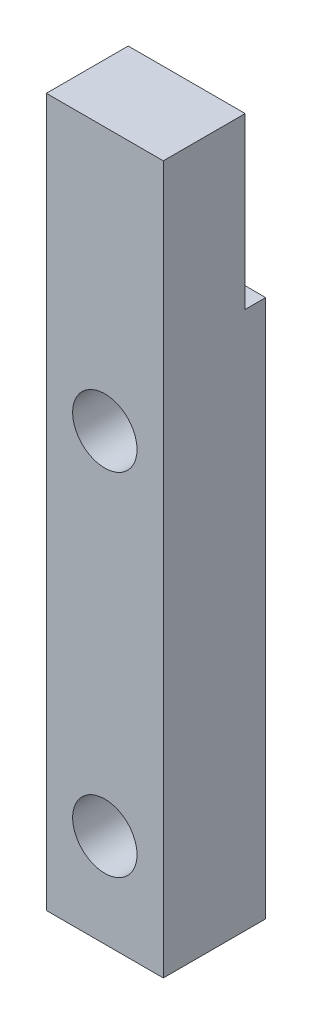
ISO-10303-21;
HEADER;
FILE_DESCRIPTION(('STEP AP214'),'2;1');
FILE_NAME('part.step','',(''),(''),'','','');
FILE_SCHEMA(('AUTOMOTIVE_DESIGN { 1 0 10303 214 1 1 1 1 }'));
ENDSEC;
DATA;
#1=APPLICATION_CONTEXT('core data for automotive mechanical design processes');
#2=APPLICATION_PROTOCOL_DEFINITION('international standard','automotive_design',2000,#1);
#3=PRODUCT_CONTEXT('',#1,'mechanical');
#4=PRODUCT('Part','Part','',(#3));
#5=PRODUCT_RELATED_PRODUCT_CATEGORY('part','',(#4));
#6=PRODUCT_DEFINITION_FORMATION('','',#4);
#7=PRODUCT_DEFINITION_CONTEXT('part definition',#1,'design');
#8=PRODUCT_DEFINITION('design','',#6,#7);
#9=PRODUCT_DEFINITION_SHAPE('','',#8);
#10=(LENGTH_UNIT() NAMED_UNIT(*) SI_UNIT(.MILLI.,.METRE.));
#11=(NAMED_UNIT(*) PLANE_ANGLE_UNIT() SI_UNIT($,.RADIAN.));
#12=(NAMED_UNIT(*) SI_UNIT($,.STERADIAN.) SOLID_ANGLE_UNIT());
#13=UNCERTAINTY_MEASURE_WITH_UNIT(LENGTH_MEASURE(1.E-05),#10,'distance_accuracy_value','');
#14=(GEOMETRIC_REPRESENTATION_CONTEXT(3) GLOBAL_UNCERTAINTY_ASSIGNED_CONTEXT((#13)) GLOBAL_UNIT_ASSIGNED_CONTEXT((#10,
#11,#12)) REPRESENTATION_CONTEXT('',''));
#15=CARTESIAN_POINT('',(0.,0.,0.));
#16=DIRECTION('',(0.,0.,1.));
#17=DIRECTION('',(1.,0.,0.));
#18=AXIS2_PLACEMENT_3D('',#15,#16,#17);
#19=CARTESIAN_POINT('',(0.,0.,300.));
#20=DIRECTION('',(0.,0.,-1.));
#21=DIRECTION('',(-1.,0.,0.));
#22=AXIS2_PLACEMENT_3D('',#19,#20,#21);
#23=PLANE('',#22);
#24=CARTESIAN_POINT('',(85.,-9.99999999999999,300.));
#25=DIRECTION('',(0.,0.,1.));
#26=DIRECTION('',(1.,0.,0.));
#27=AXIS2_PLACEMENT_3D('',#24,#25,#26);
#28=CIRCLE('',#27,5.5);
#29=CARTESIAN_POINT('',(90.5,-9.99999999999999,300.));
#30=VERTEX_POINT('',#29);
#31=EDGE_CURVE('E96',#30,#30,#28,.T.);
#32=ORIENTED_EDGE('',*,*,#31,.T.);
#33=EDGE_LOOP('',(#32));
#34=FACE_BOUND('',#33,.T.);
#35=DIRECTION('',(1.,0.,0.));
#36=VECTOR('',#35,1.);
#37=CARTESIAN_POINT('',(85.,-26.,300.));
#38=LINE('',#37,#36);
#39=CARTESIAN_POINT('',(75.,-26.,300.));
#40=VERTEX_POINT('',#39);
#41=CARTESIAN_POINT('',(95.,-26.,300.));
#42=VERTEX_POINT('',#41);
#43=EDGE_CURVE('E72',#40,#42,#38,.T.);
#44=ORIENTED_EDGE('',*,*,#43,.F.);
#45=DIRECTION('',(0.,-1.,0.));
#46=VECTOR('',#45,1.);
#47=CARTESIAN_POINT('',(75.,60.,300.));
#48=LINE('',#47,#46);
#49=CARTESIAN_POINT('',(75.,66.,300.));
#50=VERTEX_POINT('',#49);
#51=EDGE_CURVE('E85',#50,#40,#48,.T.);
#52=ORIENTED_EDGE('',*,*,#51,.F.);
#53=DIRECTION('',(-1.,0.,0.));
#54=VECTOR('',#53,1.);
#55=CARTESIAN_POINT('',(75.,66.,300.));
#56=LINE('',#55,#54);
#57=CARTESIAN_POINT('',(95.,66.,300.));
#58=VERTEX_POINT('',#57);
#59=EDGE_CURVE('E71',#58,#50,#56,.T.);
#60=ORIENTED_EDGE('',*,*,#59,.F.);
#61=DIRECTION('',(0.,1.,0.));
#62=VECTOR('',#61,1.);
#63=CARTESIAN_POINT('',(95.,-26.,300.));
#64=LINE('',#63,#62);
#65=EDGE_CURVE('E64',#42,#58,#64,.T.);
#66=ORIENTED_EDGE('',*,*,#65,.F.);
#67=EDGE_LOOP('',(#44,#52,#60,#66));
#68=FACE_BOUND('',#67,.T.);
#69=CARTESIAN_POINT('',(85.,50.,300.));
#70=DIRECTION('',(0.,0.,1.));
#71=DIRECTION('',(1.,0.,0.));
#72=AXIS2_PLACEMENT_3D('',#69,#70,#71);
#73=CIRCLE('',#72,5.5);
#74=CARTESIAN_POINT('',(90.5,50.,300.));
#75=VERTEX_POINT('',#74);
#76=EDGE_CURVE('E100',#75,#75,#73,.T.);
#77=ORIENTED_EDGE('',*,*,#76,.T.);
#78=EDGE_LOOP('',(#77));
#79=FACE_BOUND('',#78,.T.);
#80=ADVANCED_FACE('F33',(#34,#68,#79),#23,.T.);
#81=CARTESIAN_POINT('',(85.,-26.,303.5));
#82=DIRECTION('',(0.,1.,0.));
#83=DIRECTION('',(0.,0.,1.));
#84=AXIS2_PLACEMENT_3D('',#81,#82,#83);
#85=PLANE('',#84);
#86=ORIENTED_EDGE('',*,*,#43,.T.);
#87=DIRECTION('',(0.,0.,-1.));
#88=VECTOR('',#87,1.);
#89=CARTESIAN_POINT('',(95.,-26.,303.5));
#90=LINE('',#89,#88);
#91=CARTESIAN_POINT('',(95.,-26.,317.5));
#92=VERTEX_POINT('',#91);
#93=EDGE_CURVE('E42',#92,#42,#90,.T.);
#94=ORIENTED_EDGE('',*,*,#93,.F.);
#95=DIRECTION('',(1.,0.,0.));
#96=VECTOR('',#95,1.);
#97=CARTESIAN_POINT('',(75.,-26.,317.5));
#98=LINE('',#97,#96);
#99=CARTESIAN_POINT('',(75.,-26.,317.5));
#100=VERTEX_POINT('',#99);
#101=EDGE_CURVE('E127',#100,#92,#98,.T.);
#102=ORIENTED_EDGE('',*,*,#101,.F.);
#103=DIRECTION('',(0.,0.,-1.));
#104=VECTOR('',#103,1.);
#105=CARTESIAN_POINT('',(75.,-26.,303.5));
#106=LINE('',#105,#104);
#107=EDGE_CURVE('E11',#100,#40,#106,.T.);
#108=ORIENTED_EDGE('',*,*,#107,.T.);
#109=EDGE_LOOP('',(#86,#94,#102,#108));
#110=FACE_BOUND('',#109,.T.);
#111=ADVANCED_FACE('F35',(#110),#85,.F.);
#112=CARTESIAN_POINT('',(95.,-26.,303.5));
#113=DIRECTION('',(-1.,0.,0.));
#114=DIRECTION('',(0.,0.,1.));
#115=AXIS2_PLACEMENT_3D('',#112,#113,#114);
#116=PLANE('',#115);
#117=ORIENTED_EDGE('',*,*,#65,.T.);
#118=DIRECTION('',(0.,0.,-1.));
#119=VECTOR('',#118,1.);
#120=CARTESIAN_POINT('',(95.,66.,303.5));
#121=LINE('',#120,#119);
#122=CARTESIAN_POINT('',(95.,66.,303.5));
#123=VERTEX_POINT('',#122);
#124=EDGE_CURVE('E49',#123,#58,#121,.T.);
#125=ORIENTED_EDGE('',*,*,#124,.F.);
#126=DIRECTION('',(0.,1.,0.));
#127=VECTOR('',#126,1.);
#128=CARTESIAN_POINT('',(95.,66.,303.5));
#129=LINE('',#128,#127);
#130=CARTESIAN_POINT('',(95.,95.,303.5));
#131=VERTEX_POINT('',#130);
#132=EDGE_CURVE('E119',#123,#131,#129,.T.);
#133=ORIENTED_EDGE('',*,*,#132,.T.);
#134=DIRECTION('',(0.,0.,-1.));
#135=VECTOR('',#134,1.);
#136=CARTESIAN_POINT('',(95.,95.,317.5));
#137=LINE('',#136,#135);
#138=CARTESIAN_POINT('',(95.,95.,317.5));
#139=VERTEX_POINT('',#138);
#140=EDGE_CURVE('E104',#139,#131,#137,.T.);
#141=ORIENTED_EDGE('',*,*,#140,.F.);
#142=DIRECTION('',(0.,1.,0.));
#143=VECTOR('',#142,1.);
#144=CARTESIAN_POINT('',(95.,-26.,317.5));
#145=LINE('',#144,#143);
#146=EDGE_CURVE('E124',#92,#139,#145,.T.);
#147=ORIENTED_EDGE('',*,*,#146,.F.);
#148=ORIENTED_EDGE('',*,*,#93,.T.);
#149=EDGE_LOOP('',(#117,#125,#133,#141,#147,#148));
#150=FACE_BOUND('',#149,.T.);
#151=ADVANCED_FACE('F65',(#150),#116,.F.);
#152=CARTESIAN_POINT('',(75.,66.,303.5));
#153=DIRECTION('',(0.,-1.,0.));
#154=DIRECTION('',(0.,0.,-1.));
#155=AXIS2_PLACEMENT_3D('',#152,#153,#154);
#156=PLANE('',#155);
#157=ORIENTED_EDGE('',*,*,#59,.T.);
#158=DIRECTION('',(0.,0.,-1.));
#159=VECTOR('',#158,1.);
#160=CARTESIAN_POINT('',(75.,66.,303.5));
#161=LINE('',#160,#159);
#162=CARTESIAN_POINT('',(75.,66.,303.5));
#163=VERTEX_POINT('',#162);
#164=EDGE_CURVE('E81',#163,#50,#161,.T.);
#165=ORIENTED_EDGE('',*,*,#164,.F.);
#166=DIRECTION('',(-1.,0.,0.));
#167=VECTOR('',#166,1.);
#168=CARTESIAN_POINT('',(75.,66.,303.5));
#169=LINE('',#168,#167);
#170=EDGE_CURVE('E79',#123,#163,#169,.T.);
#171=ORIENTED_EDGE('',*,*,#170,.F.);
#172=ORIENTED_EDGE('',*,*,#124,.T.);
#173=EDGE_LOOP('',(#157,#165,#171,#172));
#174=FACE_BOUND('',#173,.T.);
#175=ADVANCED_FACE('F75',(#174),#156,.F.);
#176=CARTESIAN_POINT('',(75.,60.,303.5));
#177=DIRECTION('',(1.,0.,0.));
#178=DIRECTION('',(0.,1.,0.));
#179=AXIS2_PLACEMENT_3D('',#176,#177,#178);
#180=PLANE('',#179);
#181=ORIENTED_EDGE('',*,*,#51,.T.);
#182=ORIENTED_EDGE('',*,*,#107,.F.);
#183=DIRECTION('',(0.,-1.,0.));
#184=VECTOR('',#183,1.);
#185=CARTESIAN_POINT('',(75.,10.,317.5));
#186=LINE('',#185,#184);
#187=CARTESIAN_POINT('',(75.,95.,317.5));
#188=VERTEX_POINT('',#187);
#189=EDGE_CURVE('E115',#188,#100,#186,.T.);
#190=ORIENTED_EDGE('',*,*,#189,.F.);
#191=DIRECTION('',(0.,0.,-1.));
#192=VECTOR('',#191,1.);
#193=CARTESIAN_POINT('',(75.,95.,317.5));
#194=LINE('',#193,#192);
#195=CARTESIAN_POINT('',(75.,95.,303.5));
#196=VERTEX_POINT('',#195);
#197=EDGE_CURVE('E107',#188,#196,#194,.T.);
#198=ORIENTED_EDGE('',*,*,#197,.T.);
#199=DIRECTION('',(0.,-1.,0.));
#200=VECTOR('',#199,1.);
#201=CARTESIAN_POINT('',(75.,10.,303.5));
#202=LINE('',#201,#200);
#203=EDGE_CURVE('E113',#196,#163,#202,.T.);
#204=ORIENTED_EDGE('',*,*,#203,.T.);
#205=ORIENTED_EDGE('',*,*,#164,.T.);
#206=EDGE_LOOP('',(#181,#182,#190,#198,#204,#205));
#207=FACE_BOUND('',#206,.T.);
#208=ADVANCED_FACE('F164',(#207),#180,.F.);
#209=CARTESIAN_POINT('',(85.,-9.99999999999999,303.5));
#210=DIRECTION('',(0.,0.,-1.));
#211=DIRECTION('',(-1.,0.,0.));
#212=AXIS2_PLACEMENT_3D('',#209,#210,#211);
#213=CYLINDRICAL_SURFACE('',#212,5.5);
#214=ORIENTED_EDGE('',*,*,#31,.F.);
#215=EDGE_LOOP('',(#214));
#216=FACE_BOUND('',#215,.T.);
#217=CARTESIAN_POINT('',(85.,-9.99999999999999,317.5));
#218=DIRECTION('',(0.,0.,1.));
#219=DIRECTION('',(1.,0.,0.));
#220=AXIS2_PLACEMENT_3D('',#217,#218,#219);
#221=CIRCLE('',#220,5.5);
#222=CARTESIAN_POINT('',(90.5,-9.99999999999999,317.5));
#223=VERTEX_POINT('',#222);
#224=EDGE_CURVE('E121',#223,#223,#221,.T.);
#225=ORIENTED_EDGE('',*,*,#224,.T.);
#226=EDGE_LOOP('',(#225));
#227=FACE_BOUND('',#226,.T.);
#228=ADVANCED_FACE('F162',(#216,#227),#213,.F.);
#229=CARTESIAN_POINT('',(85.,50.,303.5));
#230=DIRECTION('',(0.,0.,-1.));
#231=DIRECTION('',(-1.,0.,0.));
#232=AXIS2_PLACEMENT_3D('',#229,#230,#231);
#233=CYLINDRICAL_SURFACE('',#232,5.5);
#234=ORIENTED_EDGE('',*,*,#76,.F.);
#235=EDGE_LOOP('',(#234));
#236=FACE_BOUND('',#235,.T.);
#237=CARTESIAN_POINT('',(85.,50.,317.5));
#238=DIRECTION('',(0.,0.,1.));
#239=DIRECTION('',(1.,0.,0.));
#240=AXIS2_PLACEMENT_3D('',#237,#238,#239);
#241=CIRCLE('',#240,5.5);
#242=CARTESIAN_POINT('',(90.5,50.,317.5));
#243=VERTEX_POINT('',#242);
#244=EDGE_CURVE('E134',#243,#243,#241,.T.);
#245=ORIENTED_EDGE('',*,*,#244,.T.);
#246=EDGE_LOOP('',(#245));
#247=FACE_BOUND('',#246,.T.);
#248=ADVANCED_FACE('F138',(#236,#247),#233,.F.);
#249=CARTESIAN_POINT('',(0.,0.,303.5));
#250=DIRECTION('',(0.,0.,1.));
#251=DIRECTION('',(1.,0.,0.));
#252=AXIS2_PLACEMENT_3D('',#249,#250,#251);
#253=PLANE('',#252);
#254=ORIENTED_EDGE('',*,*,#132,.F.);
#255=ORIENTED_EDGE('',*,*,#170,.T.);
#256=ORIENTED_EDGE('',*,*,#203,.F.);
#257=DIRECTION('',(-1.,0.,0.));
#258=VECTOR('',#257,1.);
#259=CARTESIAN_POINT('',(75.,95.,303.5));
#260=LINE('',#259,#258);
#261=EDGE_CURVE('E116',#131,#196,#260,.T.);
#262=ORIENTED_EDGE('',*,*,#261,.F.);
#263=EDGE_LOOP('',(#254,#255,#256,#262));
#264=FACE_BOUND('',#263,.T.);
#265=ADVANCED_FACE('F143',(#264),#253,.F.);
#266=CARTESIAN_POINT('',(0.,0.,317.5));
#267=DIRECTION('',(0.,0.,1.));
#268=DIRECTION('',(1.,0.,0.));
#269=AXIS2_PLACEMENT_3D('',#266,#267,#268);
#270=PLANE('',#269);
#271=ORIENTED_EDGE('',*,*,#224,.F.);
#272=EDGE_LOOP('',(#271));
#273=FACE_BOUND('',#272,.T.);
#274=ORIENTED_EDGE('',*,*,#189,.T.);
#275=ORIENTED_EDGE('',*,*,#101,.T.);
#276=ORIENTED_EDGE('',*,*,#146,.T.);
#277=DIRECTION('',(-1.,0.,0.));
#278=VECTOR('',#277,1.);
#279=CARTESIAN_POINT('',(75.,95.,317.5));
#280=LINE('',#279,#278);
#281=EDGE_CURVE('E112',#139,#188,#280,.T.);
#282=ORIENTED_EDGE('',*,*,#281,.T.);
#283=EDGE_LOOP('',(#274,#275,#276,#282));
#284=FACE_BOUND('',#283,.T.);
#285=ORIENTED_EDGE('',*,*,#244,.F.);
#286=EDGE_LOOP('',(#285));
#287=FACE_BOUND('',#286,.T.);
#288=ADVANCED_FACE('F140',(#273,#284,#287),#270,.T.);
#289=CARTESIAN_POINT('',(75.,95.,317.5));
#290=DIRECTION('',(0.,-1.,0.));
#291=DIRECTION('',(0.,0.,-1.));
#292=AXIS2_PLACEMENT_3D('',#289,#290,#291);
#293=PLANE('',#292);
#294=ORIENTED_EDGE('',*,*,#261,.T.);
#295=ORIENTED_EDGE('',*,*,#197,.F.);
#296=ORIENTED_EDGE('',*,*,#281,.F.);
#297=ORIENTED_EDGE('',*,*,#140,.T.);
#298=EDGE_LOOP('',(#294,#295,#296,#297));
#299=FACE_BOUND('',#298,.T.);
#300=ADVANCED_FACE('F142',(#299),#293,.F.);
#301=CLOSED_SHELL('',(#80,#111,#151,#175,#208,#228,#248,#265,#288,#300));
#302=MANIFOLD_SOLID_BREP('B2',#301);
#303=ADVANCED_BREP_SHAPE_REPRESENTATION('',(#18,#302),#14);
#304=SHAPE_DEFINITION_REPRESENTATION(#9,#303);
ENDSEC;
END-ISO-10303-21;
